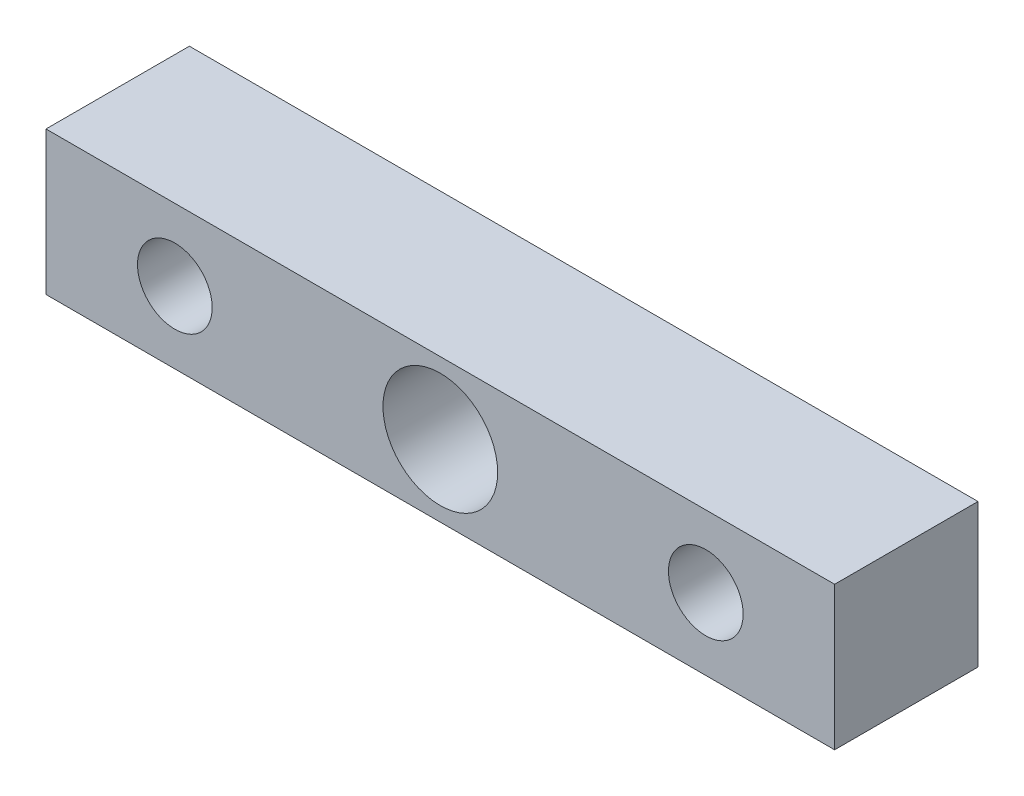
ISO-10303-21;
HEADER;
FILE_DESCRIPTION(('STEP AP214'),'2;1');
FILE_NAME('part.step','',(''),(''),'','','');
FILE_SCHEMA(('AUTOMOTIVE_DESIGN { 1 0 10303 214 1 1 1 1 }'));
ENDSEC;
DATA;
#1=APPLICATION_CONTEXT('core data for automotive mechanical design processes');
#2=APPLICATION_PROTOCOL_DEFINITION('international standard','automotive_design',2000,#1);
#3=PRODUCT_CONTEXT('',#1,'mechanical');
#4=PRODUCT('Part','Part','',(#3));
#5=PRODUCT_RELATED_PRODUCT_CATEGORY('part','',(#4));
#6=PRODUCT_DEFINITION_FORMATION('','',#4);
#7=PRODUCT_DEFINITION_CONTEXT('part definition',#1,'design');
#8=PRODUCT_DEFINITION('design','',#6,#7);
#9=PRODUCT_DEFINITION_SHAPE('','',#8);
#10=(LENGTH_UNIT() NAMED_UNIT(*) SI_UNIT(.MILLI.,.METRE.));
#11=(NAMED_UNIT(*) PLANE_ANGLE_UNIT() SI_UNIT($,.RADIAN.));
#12=(NAMED_UNIT(*) SI_UNIT($,.STERADIAN.) SOLID_ANGLE_UNIT());
#13=UNCERTAINTY_MEASURE_WITH_UNIT(LENGTH_MEASURE(1.E-05),#10,'distance_accuracy_value','');
#14=(GEOMETRIC_REPRESENTATION_CONTEXT(3) GLOBAL_UNCERTAINTY_ASSIGNED_CONTEXT((#13)) GLOBAL_UNIT_ASSIGNED_CONTEXT((#10,
#11,#12)) REPRESENTATION_CONTEXT('',''));
#15=CARTESIAN_POINT('',(0.,0.,0.));
#16=DIRECTION('',(0.,0.,1.));
#17=DIRECTION('',(1.,0.,0.));
#18=AXIS2_PLACEMENT_3D('',#15,#16,#17);
#19=CARTESIAN_POINT('',(27.5,-5.,10.));
#20=DIRECTION('',(-1.,0.,0.));
#21=DIRECTION('',(0.,0.,1.));
#22=AXIS2_PLACEMENT_3D('',#19,#20,#21);
#23=PLANE('',#22);
#24=DIRECTION('',(0.,1.,0.));
#25=VECTOR('',#24,1.);
#26=CARTESIAN_POINT('',(27.5,-5.,0.));
#27=LINE('',#26,#25);
#28=CARTESIAN_POINT('',(27.5,-5.,0.));
#29=VERTEX_POINT('',#28);
#30=CARTESIAN_POINT('',(27.5,5.,0.));
#31=VERTEX_POINT('',#30);
#32=EDGE_CURVE('E115',#29,#31,#27,.T.);
#33=ORIENTED_EDGE('',*,*,#32,.T.);
#34=DIRECTION('',(0.,0.,-1.));
#35=VECTOR('',#34,1.);
#36=CARTESIAN_POINT('',(27.5,5.,10.));
#37=LINE('',#36,#35);
#38=CARTESIAN_POINT('',(27.5,5.,10.));
#39=VERTEX_POINT('',#38);
#40=EDGE_CURVE('E11',#39,#31,#37,.T.);
#41=ORIENTED_EDGE('',*,*,#40,.F.);
#42=DIRECTION('',(0.,1.,0.));
#43=VECTOR('',#42,1.);
#44=CARTESIAN_POINT('',(27.5,-5.,10.));
#45=LINE('',#44,#43);
#46=CARTESIAN_POINT('',(27.5,-5.,10.));
#47=VERTEX_POINT('',#46);
#48=EDGE_CURVE('E96',#47,#39,#45,.T.);
#49=ORIENTED_EDGE('',*,*,#48,.F.);
#50=DIRECTION('',(0.,0.,-1.));
#51=VECTOR('',#50,1.);
#52=CARTESIAN_POINT('',(27.5,-5.,10.));
#53=LINE('',#52,#51);
#54=EDGE_CURVE('E107',#47,#29,#53,.T.);
#55=ORIENTED_EDGE('',*,*,#54,.T.);
#56=EDGE_LOOP('',(#33,#41,#49,#55));
#57=FACE_BOUND('',#56,.T.);
#58=ADVANCED_FACE('F42',(#57),#23,.F.);
#59=CARTESIAN_POINT('',(-27.5,5.,10.));
#60=DIRECTION('',(0.,-1.,0.));
#61=DIRECTION('',(0.,0.,-1.));
#62=AXIS2_PLACEMENT_3D('',#59,#60,#61);
#63=PLANE('',#62);
#64=DIRECTION('',(-1.,0.,0.));
#65=VECTOR('',#64,1.);
#66=CARTESIAN_POINT('',(-27.5,5.,0.));
#67=LINE('',#66,#65);
#68=CARTESIAN_POINT('',(-27.5,5.,0.));
#69=VERTEX_POINT('',#68);
#70=EDGE_CURVE('E101',#31,#69,#67,.T.);
#71=ORIENTED_EDGE('',*,*,#70,.T.);
#72=DIRECTION('',(0.,0.,-1.));
#73=VECTOR('',#72,1.);
#74=CARTESIAN_POINT('',(-27.5,5.,10.));
#75=LINE('',#74,#73);
#76=CARTESIAN_POINT('',(-27.5,5.,10.));
#77=VERTEX_POINT('',#76);
#78=EDGE_CURVE('E52',#77,#69,#75,.T.);
#79=ORIENTED_EDGE('',*,*,#78,.F.);
#80=DIRECTION('',(-1.,0.,0.));
#81=VECTOR('',#80,1.);
#82=CARTESIAN_POINT('',(-27.5,5.,10.));
#83=LINE('',#82,#81);
#84=EDGE_CURVE('E93',#39,#77,#83,.T.);
#85=ORIENTED_EDGE('',*,*,#84,.F.);
#86=ORIENTED_EDGE('',*,*,#40,.T.);
#87=EDGE_LOOP('',(#71,#79,#85,#86));
#88=FACE_BOUND('',#87,.T.);
#89=ADVANCED_FACE('F99',(#88),#63,.F.);
#90=CARTESIAN_POINT('',(-27.5,-5.,10.));
#91=DIRECTION('',(1.,0.,0.));
#92=DIRECTION('',(0.,0.,-1.));
#93=AXIS2_PLACEMENT_3D('',#90,#91,#92);
#94=PLANE('',#93);
#95=DIRECTION('',(0.,-1.,0.));
#96=VECTOR('',#95,1.);
#97=CARTESIAN_POINT('',(-27.5,-5.,0.));
#98=LINE('',#97,#96);
#99=CARTESIAN_POINT('',(-27.5,-5.,0.));
#100=VERTEX_POINT('',#99);
#101=EDGE_CURVE('E79',#69,#100,#98,.T.);
#102=ORIENTED_EDGE('',*,*,#101,.T.);
#103=DIRECTION('',(0.,0.,-1.));
#104=VECTOR('',#103,1.);
#105=CARTESIAN_POINT('',(-27.5,-5.,10.));
#106=LINE('',#105,#104);
#107=CARTESIAN_POINT('',(-27.5,-5.,10.));
#108=VERTEX_POINT('',#107);
#109=EDGE_CURVE('E103',#108,#100,#106,.T.);
#110=ORIENTED_EDGE('',*,*,#109,.F.);
#111=DIRECTION('',(0.,-1.,0.));
#112=VECTOR('',#111,1.);
#113=CARTESIAN_POINT('',(-27.5,-5.,10.));
#114=LINE('',#113,#112);
#115=EDGE_CURVE('E94',#77,#108,#114,.T.);
#116=ORIENTED_EDGE('',*,*,#115,.F.);
#117=ORIENTED_EDGE('',*,*,#78,.T.);
#118=EDGE_LOOP('',(#102,#110,#116,#117));
#119=FACE_BOUND('',#118,.T.);
#120=ADVANCED_FACE('F102',(#119),#94,.F.);
#121=CARTESIAN_POINT('',(-27.5,-5.,10.));
#122=DIRECTION('',(0.,1.,0.));
#123=DIRECTION('',(0.,0.,1.));
#124=AXIS2_PLACEMENT_3D('',#121,#122,#123);
#125=PLANE('',#124);
#126=DIRECTION('',(1.,0.,0.));
#127=VECTOR('',#126,1.);
#128=CARTESIAN_POINT('',(-27.5,-5.,0.));
#129=LINE('',#128,#127);
#130=EDGE_CURVE('E84',#100,#29,#129,.T.);
#131=ORIENTED_EDGE('',*,*,#130,.T.);
#132=ORIENTED_EDGE('',*,*,#54,.F.);
#133=DIRECTION('',(1.,0.,0.));
#134=VECTOR('',#133,1.);
#135=CARTESIAN_POINT('',(-27.5,-5.,10.));
#136=LINE('',#135,#134);
#137=EDGE_CURVE('E62',#108,#47,#136,.T.);
#138=ORIENTED_EDGE('',*,*,#137,.F.);
#139=ORIENTED_EDGE('',*,*,#109,.T.);
#140=EDGE_LOOP('',(#131,#132,#138,#139));
#141=FACE_BOUND('',#140,.T.);
#142=ADVANCED_FACE('F127',(#141),#125,.F.);
#143=CARTESIAN_POINT('',(0.,0.,10.));
#144=DIRECTION('',(0.,0.,-1.));
#145=DIRECTION('',(-1.,0.,0.));
#146=AXIS2_PLACEMENT_3D('',#143,#144,#145);
#147=PLANE('',#146);
#148=CARTESIAN_POINT('',(0.,0.,10.));
#149=DIRECTION('',(0.,0.,1.));
#150=DIRECTION('',(1.,0.,0.));
#151=AXIS2_PLACEMENT_3D('',#148,#149,#150);
#152=CIRCLE('',#151,4.);
#153=CARTESIAN_POINT('',(4.,0.,10.));
#154=VERTEX_POINT('',#153);
#155=EDGE_CURVE('E149',#154,#154,#152,.T.);
#156=ORIENTED_EDGE('',*,*,#155,.F.);
#157=EDGE_LOOP('',(#156));
#158=FACE_BOUND('',#157,.T.);
#159=CARTESIAN_POINT('',(18.515,0.,10.));
#160=DIRECTION('',(0.,0.,1.));
#161=DIRECTION('',(1.,0.,0.));
#162=AXIS2_PLACEMENT_3D('',#159,#160,#161);
#163=CIRCLE('',#162,2.605);
#164=CARTESIAN_POINT('',(21.12,0.,10.));
#165=VERTEX_POINT('',#164);
#166=EDGE_CURVE('E142',#165,#165,#163,.T.);
#167=ORIENTED_EDGE('',*,*,#166,.F.);
#168=EDGE_LOOP('',(#167));
#169=FACE_BOUND('',#168,.T.);
#170=CARTESIAN_POINT('',(-18.515,0.,10.));
#171=DIRECTION('',(0.,0.,1.));
#172=DIRECTION('',(1.,0.,0.));
#173=AXIS2_PLACEMENT_3D('',#170,#171,#172);
#174=CIRCLE('',#173,2.605);
#175=CARTESIAN_POINT('',(-15.91,0.,10.));
#176=VERTEX_POINT('',#175);
#177=EDGE_CURVE('E140',#176,#176,#174,.T.);
#178=ORIENTED_EDGE('',*,*,#177,.F.);
#179=EDGE_LOOP('',(#178));
#180=FACE_BOUND('',#179,.T.);
#181=ORIENTED_EDGE('',*,*,#48,.T.);
#182=ORIENTED_EDGE('',*,*,#84,.T.);
#183=ORIENTED_EDGE('',*,*,#115,.T.);
#184=ORIENTED_EDGE('',*,*,#137,.T.);
#185=EDGE_LOOP('',(#181,#182,#183,#184));
#186=FACE_BOUND('',#185,.T.);
#187=ADVANCED_FACE('F95',(#158,#169,#180,#186),#147,.F.);
#188=CARTESIAN_POINT('',(0.,0.,0.));
#189=DIRECTION('',(0.,0.,-1.));
#190=DIRECTION('',(-1.,0.,0.));
#191=AXIS2_PLACEMENT_3D('',#188,#189,#190);
#192=PLANE('',#191);
#193=CARTESIAN_POINT('',(0.,0.,0.));
#194=DIRECTION('',(0.,0.,1.));
#195=DIRECTION('',(1.,0.,0.));
#196=AXIS2_PLACEMENT_3D('',#193,#194,#195);
#197=CIRCLE('',#196,4.);
#198=CARTESIAN_POINT('',(4.,0.,0.));
#199=VERTEX_POINT('',#198);
#200=EDGE_CURVE('E136',#199,#199,#197,.T.);
#201=ORIENTED_EDGE('',*,*,#200,.T.);
#202=EDGE_LOOP('',(#201));
#203=FACE_BOUND('',#202,.T.);
#204=CARTESIAN_POINT('',(18.515,0.,0.));
#205=DIRECTION('',(0.,0.,1.));
#206=DIRECTION('',(1.,0.,0.));
#207=AXIS2_PLACEMENT_3D('',#204,#205,#206);
#208=CIRCLE('',#207,2.605);
#209=CARTESIAN_POINT('',(21.12,0.,0.));
#210=VERTEX_POINT('',#209);
#211=EDGE_CURVE('E117',#210,#210,#208,.T.);
#212=ORIENTED_EDGE('',*,*,#211,.T.);
#213=EDGE_LOOP('',(#212));
#214=FACE_BOUND('',#213,.T.);
#215=CARTESIAN_POINT('',(-18.515,0.,0.));
#216=DIRECTION('',(0.,0.,1.));
#217=DIRECTION('',(1.,0.,0.));
#218=AXIS2_PLACEMENT_3D('',#215,#216,#217);
#219=CIRCLE('',#218,2.605);
#220=CARTESIAN_POINT('',(-15.91,0.,0.));
#221=VERTEX_POINT('',#220);
#222=EDGE_CURVE('E134',#221,#221,#219,.T.);
#223=ORIENTED_EDGE('',*,*,#222,.T.);
#224=EDGE_LOOP('',(#223));
#225=FACE_BOUND('',#224,.T.);
#226=ORIENTED_EDGE('',*,*,#32,.F.);
#227=ORIENTED_EDGE('',*,*,#130,.F.);
#228=ORIENTED_EDGE('',*,*,#101,.F.);
#229=ORIENTED_EDGE('',*,*,#70,.F.);
#230=EDGE_LOOP('',(#226,#227,#228,#229));
#231=FACE_BOUND('',#230,.T.);
#232=ADVANCED_FACE('F129',(#203,#214,#225,#231),#192,.T.);
#233=CARTESIAN_POINT('',(-18.515,0.,0.));
#234=DIRECTION('',(0.,0.,1.));
#235=DIRECTION('',(1.,0.,0.));
#236=AXIS2_PLACEMENT_3D('',#233,#234,#235);
#237=CYLINDRICAL_SURFACE('',#236,2.605);
#238=ORIENTED_EDGE('',*,*,#222,.F.);
#239=EDGE_LOOP('',(#238));
#240=FACE_BOUND('',#239,.T.);
#241=ORIENTED_EDGE('',*,*,#177,.T.);
#242=EDGE_LOOP('',(#241));
#243=FACE_BOUND('',#242,.T.);
#244=ADVANCED_FACE('F174',(#240,#243),#237,.F.);
#245=CARTESIAN_POINT('',(18.515,0.,0.));
#246=DIRECTION('',(0.,0.,1.));
#247=DIRECTION('',(1.,0.,0.));
#248=AXIS2_PLACEMENT_3D('',#245,#246,#247);
#249=CYLINDRICAL_SURFACE('',#248,2.605);
#250=ORIENTED_EDGE('',*,*,#211,.F.);
#251=EDGE_LOOP('',(#250));
#252=FACE_BOUND('',#251,.T.);
#253=ORIENTED_EDGE('',*,*,#166,.T.);
#254=EDGE_LOOP('',(#253));
#255=FACE_BOUND('',#254,.T.);
#256=ADVANCED_FACE('F165',(#252,#255),#249,.F.);
#257=CARTESIAN_POINT('',(0.,0.,0.));
#258=DIRECTION('',(0.,0.,1.));
#259=DIRECTION('',(1.,0.,0.));
#260=AXIS2_PLACEMENT_3D('',#257,#258,#259);
#261=CYLINDRICAL_SURFACE('',#260,4.);
#262=ORIENTED_EDGE('',*,*,#200,.F.);
#263=EDGE_LOOP('',(#262));
#264=FACE_BOUND('',#263,.T.);
#265=ORIENTED_EDGE('',*,*,#155,.T.);
#266=EDGE_LOOP('',(#265));
#267=FACE_BOUND('',#266,.T.);
#268=ADVANCED_FACE('F157',(#264,#267),#261,.F.);
#269=CLOSED_SHELL('',(#58,#89,#120,#142,#187,#232,#244,#256,#268));
#270=MANIFOLD_SOLID_BREP('B2',#269);
#271=ADVANCED_BREP_SHAPE_REPRESENTATION('',(#18,#270),#14);
#272=SHAPE_DEFINITION_REPRESENTATION(#9,#271);
ENDSEC;
END-ISO-10303-21;
